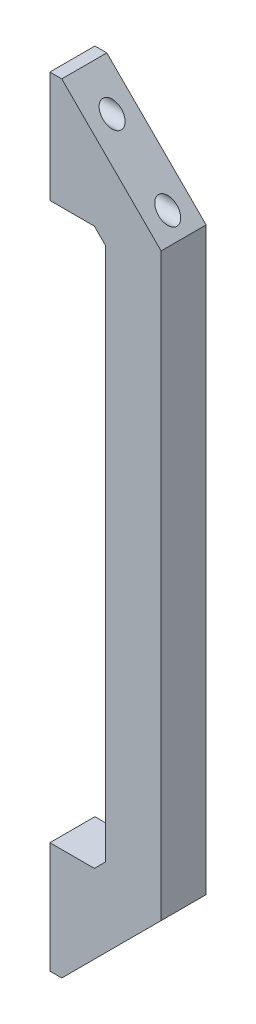
ISO-10303-21;
HEADER;
FILE_DESCRIPTION(('STEP AP214'),'2;1');
FILE_NAME('part.step','',(''),(''),'','','');
FILE_SCHEMA(('AUTOMOTIVE_DESIGN { 1 0 10303 214 1 1 1 1 }'));
ENDSEC;
DATA;
#1=APPLICATION_CONTEXT('core data for automotive mechanical design processes');
#2=APPLICATION_PROTOCOL_DEFINITION('international standard','automotive_design',2000,#1);
#3=PRODUCT_CONTEXT('',#1,'mechanical');
#4=PRODUCT('Part','Part','',(#3));
#5=PRODUCT_RELATED_PRODUCT_CATEGORY('part','',(#4));
#6=PRODUCT_DEFINITION_FORMATION('','',#4);
#7=PRODUCT_DEFINITION_CONTEXT('part definition',#1,'design');
#8=PRODUCT_DEFINITION('design','',#6,#7);
#9=PRODUCT_DEFINITION_SHAPE('','',#8);
#10=(LENGTH_UNIT() NAMED_UNIT(*) SI_UNIT(.MILLI.,.METRE.));
#11=(NAMED_UNIT(*) PLANE_ANGLE_UNIT() SI_UNIT($,.RADIAN.));
#12=(NAMED_UNIT(*) SI_UNIT($,.STERADIAN.) SOLID_ANGLE_UNIT());
#13=UNCERTAINTY_MEASURE_WITH_UNIT(LENGTH_MEASURE(1.E-05),#10,'distance_accuracy_value','');
#14=(GEOMETRIC_REPRESENTATION_CONTEXT(3) GLOBAL_UNCERTAINTY_ASSIGNED_CONTEXT((#13)) GLOBAL_UNIT_ASSIGNED_CONTEXT((#10,
#11,#12)) REPRESENTATION_CONTEXT('',''));
#15=CARTESIAN_POINT('',(0.,0.,0.));
#16=DIRECTION('',(0.,0.,1.));
#17=DIRECTION('',(1.,0.,0.));
#18=AXIS2_PLACEMENT_3D('',#15,#16,#17);
#19=CARTESIAN_POINT('',(0.,0.,8.1));
#20=DIRECTION('',(0.,1.,0.));
#21=DIRECTION('',(-1.,0.,0.));
#22=AXIS2_PLACEMENT_3D('',#19,#20,#21);
#23=PLANE('',#22);
#24=DIRECTION('',(1.,0.,0.));
#25=VECTOR('',#24,1.);
#26=CARTESIAN_POINT('',(0.,0.,0.));
#27=LINE('',#26,#25);
#28=CARTESIAN_POINT('',(0.,0.,0.));
#29=VERTEX_POINT('',#28);
#30=CARTESIAN_POINT('',(2.14213562373119,0.,0.));
#31=VERTEX_POINT('',#30);
#32=EDGE_CURVE('E153',#29,#31,#27,.T.);
#33=ORIENTED_EDGE('',*,*,#32,.T.);
#34=DIRECTION('',(0.,0.,-1.));
#35=VECTOR('',#34,1.);
#36=CARTESIAN_POINT('',(2.14213562373119,0.,8.1));
#37=LINE('',#36,#35);
#38=CARTESIAN_POINT('',(2.14213562373119,0.,8.1));
#39=VERTEX_POINT('',#38);
#40=EDGE_CURVE('E11',#39,#31,#37,.T.);
#41=ORIENTED_EDGE('',*,*,#40,.F.);
#42=DIRECTION('',(1.,0.,0.));
#43=VECTOR('',#42,1.);
#44=CARTESIAN_POINT('',(0.,0.,8.1));
#45=LINE('',#44,#43);
#46=CARTESIAN_POINT('',(0.,0.,8.1));
#47=VERTEX_POINT('',#46);
#48=EDGE_CURVE('E176',#47,#39,#45,.T.);
#49=ORIENTED_EDGE('',*,*,#48,.F.);
#50=DIRECTION('',(0.,0.,-1.));
#51=VECTOR('',#50,1.);
#52=CARTESIAN_POINT('',(0.,0.,8.1));
#53=LINE('',#52,#51);
#54=EDGE_CURVE('E149',#47,#29,#53,.T.);
#55=ORIENTED_EDGE('',*,*,#54,.T.);
#56=EDGE_LOOP('',(#33,#41,#49,#55));
#57=FACE_BOUND('',#56,.T.);
#58=ADVANCED_FACE('F33',(#57),#23,.F.);
#59=CARTESIAN_POINT('',(2.14213562373119,0.,8.1));
#60=DIRECTION('',(-0.707106781186554,0.707106781186541,0.));
#61=DIRECTION('',(-0.707106781186541,-0.707106781186554,0.));
#62=AXIS2_PLACEMENT_3D('',#59,#60,#61);
#63=PLANE('',#62);
#64=CARTESIAN_POINT('',(7.1421356237311,5.,4.05));
#65=DIRECTION('',(-0.707106781186554,0.707106781186541,0.));
#66=DIRECTION('',(-0.707106781186541,-0.707106781186554,0.));
#67=AXIS2_PLACEMENT_3D('',#64,#65,#66);
#68=ELLIPSE('',#67,2.33345237791559,1.65);
#69=CARTESIAN_POINT('',(5.49213562373113,3.35,4.05));
#70=VERTEX_POINT('',#69);
#71=EDGE_CURVE('E389',#70,#70,#68,.T.);
#72=ORIENTED_EDGE('',*,*,#71,.T.);
#73=EDGE_LOOP('',(#72));
#74=FACE_BOUND('',#73,.T.);
#75=CARTESIAN_POINT('',(17.1421356237309,15.,4.05));
#76=DIRECTION('',(-0.707106781186554,0.707106781186541,0.));
#77=DIRECTION('',(-0.707106781186541,-0.707106781186554,0.));
#78=AXIS2_PLACEMENT_3D('',#75,#76,#77);
#79=ELLIPSE('',#78,2.33345237791559,1.65);
#80=CARTESIAN_POINT('',(15.4921356237309,13.35,4.05));
#81=VERTEX_POINT('',#80);
#82=EDGE_CURVE('E157',#81,#81,#79,.T.);
#83=ORIENTED_EDGE('',*,*,#82,.T.);
#84=EDGE_LOOP('',(#83));
#85=FACE_BOUND('',#84,.T.);
#86=DIRECTION('',(0.707106781186541,0.707106781186554,0.));
#87=VECTOR('',#86,1.);
#88=CARTESIAN_POINT('',(2.14213562373119,0.,0.));
#89=LINE('',#88,#87);
#90=CARTESIAN_POINT('',(20.,17.8578643762691,0.));
#91=VERTEX_POINT('',#90);
#92=EDGE_CURVE('E156',#31,#91,#89,.T.);
#93=ORIENTED_EDGE('',*,*,#92,.T.);
#94=DIRECTION('',(0.,0.,-1.));
#95=VECTOR('',#94,1.);
#96=CARTESIAN_POINT('',(20.,17.8578643762691,8.1));
#97=LINE('',#96,#95);
#98=CARTESIAN_POINT('',(20.,17.8578643762691,8.1));
#99=VERTEX_POINT('',#98);
#100=EDGE_CURVE('E41',#99,#91,#97,.T.);
#101=ORIENTED_EDGE('',*,*,#100,.F.);
#102=DIRECTION('',(0.707106781186541,0.707106781186554,0.));
#103=VECTOR('',#102,1.);
#104=CARTESIAN_POINT('',(2.14213562373119,0.,8.1));
#105=LINE('',#104,#103);
#106=EDGE_CURVE('E104',#39,#99,#105,.T.);
#107=ORIENTED_EDGE('',*,*,#106,.F.);
#108=ORIENTED_EDGE('',*,*,#40,.T.);
#109=EDGE_LOOP('',(#93,#101,#107,#108));
#110=FACE_BOUND('',#109,.T.);
#111=ADVANCED_FACE('F257',(#74,#85,#110),#63,.F.);
#112=CARTESIAN_POINT('',(20.,17.8578643762691,8.1));
#113=DIRECTION('',(-1.,0.,0.));
#114=DIRECTION('',(0.,-1.,0.));
#115=AXIS2_PLACEMENT_3D('',#112,#113,#114);
#116=PLANE('',#115);
#117=DIRECTION('',(0.,1.,0.));
#118=VECTOR('',#117,1.);
#119=CARTESIAN_POINT('',(20.,17.8578643762691,0.));
#120=LINE('',#119,#118);
#121=CARTESIAN_POINT('',(20.,122.142135623731,0.));
#122=VERTEX_POINT('',#121);
#123=EDGE_CURVE('E159',#91,#122,#120,.T.);
#124=ORIENTED_EDGE('',*,*,#123,.T.);
#125=DIRECTION('',(0.,0.,-1.));
#126=VECTOR('',#125,1.);
#127=CARTESIAN_POINT('',(20.,122.142135623731,8.1));
#128=LINE('',#127,#126);
#129=CARTESIAN_POINT('',(20.,122.142135623731,8.1));
#130=VERTEX_POINT('',#129);
#131=EDGE_CURVE('E195',#130,#122,#128,.T.);
#132=ORIENTED_EDGE('',*,*,#131,.F.);
#133=DIRECTION('',(0.,1.,0.));
#134=VECTOR('',#133,1.);
#135=CARTESIAN_POINT('',(20.,17.8578643762691,8.1));
#136=LINE('',#135,#134);
#137=EDGE_CURVE('E203',#99,#130,#136,.T.);
#138=ORIENTED_EDGE('',*,*,#137,.F.);
#139=ORIENTED_EDGE('',*,*,#100,.T.);
#140=EDGE_LOOP('',(#124,#132,#138,#139));
#141=FACE_BOUND('',#140,.T.);
#142=ADVANCED_FACE('F201',(#141),#116,.F.);
#143=CARTESIAN_POINT('',(2.14213562373117,140.,8.1));
#144=DIRECTION('',(-0.707106781186554,-0.707106781186541,0.));
#145=DIRECTION('',(0.707106781186541,-0.707106781186554,0.));
#146=AXIS2_PLACEMENT_3D('',#143,#144,#145);
#147=PLANE('',#146);
#148=CARTESIAN_POINT('',(7.14213562373108,135.,4.05));
#149=DIRECTION('',(-0.707106781186554,-0.707106781186541,0.));
#150=DIRECTION('',(-0.707106781186541,0.707106781186554,0.));
#151=AXIS2_PLACEMENT_3D('',#148,#149,#150);
#152=ELLIPSE('',#151,2.3334523779156,1.65000000000001);
#153=CARTESIAN_POINT('',(5.49213562373111,136.65,4.05));
#154=VERTEX_POINT('',#153);
#155=EDGE_CURVE('E382',#154,#154,#152,.T.);
#156=ORIENTED_EDGE('',*,*,#155,.T.);
#157=EDGE_LOOP('',(#156));
#158=FACE_BOUND('',#157,.T.);
#159=CARTESIAN_POINT('',(17.1421356237309,125.,4.05));
#160=DIRECTION('',(-0.707106781186554,-0.707106781186541,0.));
#161=DIRECTION('',(-0.707106781186541,0.707106781186554,0.));
#162=AXIS2_PLACEMENT_3D('',#159,#160,#161);
#163=ELLIPSE('',#162,2.33345237791559,1.65);
#164=CARTESIAN_POINT('',(15.4921356237309,126.65,4.05));
#165=VERTEX_POINT('',#164);
#166=EDGE_CURVE('E384',#165,#165,#163,.T.);
#167=ORIENTED_EDGE('',*,*,#166,.T.);
#168=EDGE_LOOP('',(#167));
#169=FACE_BOUND('',#168,.T.);
#170=DIRECTION('',(-0.707106781186541,0.707106781186554,0.));
#171=VECTOR('',#170,1.);
#172=CARTESIAN_POINT('',(2.14213562373117,140.,0.));
#173=LINE('',#172,#171);
#174=CARTESIAN_POINT('',(2.14213562373117,140.,0.));
#175=VERTEX_POINT('',#174);
#176=EDGE_CURVE('E161',#122,#175,#173,.T.);
#177=ORIENTED_EDGE('',*,*,#176,.T.);
#178=DIRECTION('',(0.,0.,-1.));
#179=VECTOR('',#178,1.);
#180=CARTESIAN_POINT('',(2.14213562373117,140.,8.1));
#181=LINE('',#180,#179);
#182=CARTESIAN_POINT('',(2.14213562373117,140.,8.1));
#183=VERTEX_POINT('',#182);
#184=EDGE_CURVE('E192',#183,#175,#181,.T.);
#185=ORIENTED_EDGE('',*,*,#184,.F.);
#186=DIRECTION('',(-0.707106781186541,0.707106781186554,0.));
#187=VECTOR('',#186,1.);
#188=CARTESIAN_POINT('',(2.14213562373117,140.,8.1));
#189=LINE('',#188,#187);
#190=EDGE_CURVE('E221',#130,#183,#189,.T.);
#191=ORIENTED_EDGE('',*,*,#190,.F.);
#192=ORIENTED_EDGE('',*,*,#131,.T.);
#193=EDGE_LOOP('',(#177,#185,#191,#192));
#194=FACE_BOUND('',#193,.T.);
#195=ADVANCED_FACE('F212',(#158,#169,#194),#147,.F.);
#196=CARTESIAN_POINT('',(0.,140.,8.1));
#197=DIRECTION('',(0.,-1.,0.));
#198=DIRECTION('',(0.,0.,-1.));
#199=AXIS2_PLACEMENT_3D('',#196,#197,#198);
#200=PLANE('',#199);
#201=DIRECTION('',(-1.,0.,0.));
#202=VECTOR('',#201,1.);
#203=CARTESIAN_POINT('',(0.,140.,0.));
#204=LINE('',#203,#202);
#205=CARTESIAN_POINT('',(0.,140.,0.));
#206=VERTEX_POINT('',#205);
#207=EDGE_CURVE('E163',#175,#206,#204,.T.);
#208=ORIENTED_EDGE('',*,*,#207,.T.);
#209=DIRECTION('',(0.,0.,-1.));
#210=VECTOR('',#209,1.);
#211=CARTESIAN_POINT('',(0.,140.,8.1));
#212=LINE('',#211,#210);
#213=CARTESIAN_POINT('',(0.,140.,8.1));
#214=VERTEX_POINT('',#213);
#215=EDGE_CURVE('E189',#214,#206,#212,.T.);
#216=ORIENTED_EDGE('',*,*,#215,.F.);
#217=DIRECTION('',(-1.,0.,0.));
#218=VECTOR('',#217,1.);
#219=CARTESIAN_POINT('',(0.,140.,8.1));
#220=LINE('',#219,#218);
#221=EDGE_CURVE('E218',#183,#214,#220,.T.);
#222=ORIENTED_EDGE('',*,*,#221,.F.);
#223=ORIENTED_EDGE('',*,*,#184,.T.);
#224=EDGE_LOOP('',(#208,#216,#222,#223));
#225=FACE_BOUND('',#224,.T.);
#226=ADVANCED_FACE('F216',(#225),#200,.F.);
#227=CARTESIAN_POINT('',(0.,140.,8.1));
#228=DIRECTION('',(1.,0.,0.));
#229=DIRECTION('',(0.,1.,0.));
#230=AXIS2_PLACEMENT_3D('',#227,#228,#229);
#231=PLANE('',#230);
#232=CARTESIAN_POINT('',(0.,135.,4.05));
#233=DIRECTION('',(-1.,0.,0.));
#234=DIRECTION('',(0.,0.,1.));
#235=AXIS2_PLACEMENT_3D('',#232,#233,#234);
#236=CIRCLE('',#235,1.65000000000001);
#237=CARTESIAN_POINT('',(0.,135.,5.70000000000001));
#238=VERTEX_POINT('',#237);
#239=EDGE_CURVE('E379',#238,#238,#236,.T.);
#240=ORIENTED_EDGE('',*,*,#239,.F.);
#241=EDGE_LOOP('',(#240));
#242=FACE_BOUND('',#241,.T.);
#243=CARTESIAN_POINT('',(0.,125.,4.05));
#244=DIRECTION('',(-1.,0.,0.));
#245=DIRECTION('',(0.,0.,-1.));
#246=AXIS2_PLACEMENT_3D('',#243,#244,#245);
#247=CIRCLE('',#246,1.65);
#248=CARTESIAN_POINT('',(0.,125.,2.4));
#249=VERTEX_POINT('',#248);
#250=EDGE_CURVE('E400',#249,#249,#247,.T.);
#251=ORIENTED_EDGE('',*,*,#250,.F.);
#252=EDGE_LOOP('',(#251));
#253=FACE_BOUND('',#252,.T.);
#254=DIRECTION('',(0.,-1.,0.));
#255=VECTOR('',#254,1.);
#256=CARTESIAN_POINT('',(0.,140.,0.));
#257=LINE('',#256,#255);
#258=CARTESIAN_POINT('',(0.,120.,0.));
#259=VERTEX_POINT('',#258);
#260=EDGE_CURVE('E165',#206,#259,#257,.T.);
#261=ORIENTED_EDGE('',*,*,#260,.T.);
#262=DIRECTION('',(0.,0.,-1.));
#263=VECTOR('',#262,1.);
#264=CARTESIAN_POINT('',(0.,120.,8.1));
#265=LINE('',#264,#263);
#266=CARTESIAN_POINT('',(0.,120.,8.1));
#267=VERTEX_POINT('',#266);
#268=EDGE_CURVE('E186',#267,#259,#265,.T.);
#269=ORIENTED_EDGE('',*,*,#268,.F.);
#270=DIRECTION('',(0.,-1.,0.));
#271=VECTOR('',#270,1.);
#272=CARTESIAN_POINT('',(0.,140.,8.1));
#273=LINE('',#272,#271);
#274=EDGE_CURVE('E220',#214,#267,#273,.T.);
#275=ORIENTED_EDGE('',*,*,#274,.F.);
#276=ORIENTED_EDGE('',*,*,#215,.T.);
#277=EDGE_LOOP('',(#261,#269,#275,#276));
#278=FACE_BOUND('',#277,.T.);
#279=ADVANCED_FACE('F274',(#242,#253,#278),#231,.F.);
#280=CARTESIAN_POINT('',(0.,120.,8.1));
#281=DIRECTION('',(0.,1.,0.));
#282=DIRECTION('',(-1.,0.,0.));
#283=AXIS2_PLACEMENT_3D('',#280,#281,#282);
#284=PLANE('',#283);
#285=DIRECTION('',(1.,0.,0.));
#286=VECTOR('',#285,1.);
#287=CARTESIAN_POINT('',(0.,120.,0.));
#288=LINE('',#287,#286);
#289=CARTESIAN_POINT('',(7.99999999999999,120.,0.));
#290=VERTEX_POINT('',#289);
#291=EDGE_CURVE('E167',#259,#290,#288,.T.);
#292=ORIENTED_EDGE('',*,*,#291,.T.);
#293=DIRECTION('',(0.,0.,-1.));
#294=VECTOR('',#293,1.);
#295=CARTESIAN_POINT('',(7.99999999999999,120.,8.1));
#296=LINE('',#295,#294);
#297=CARTESIAN_POINT('',(7.99999999999999,120.,8.1));
#298=VERTEX_POINT('',#297);
#299=EDGE_CURVE('E183',#298,#290,#296,.T.);
#300=ORIENTED_EDGE('',*,*,#299,.F.);
#301=DIRECTION('',(1.,0.,0.));
#302=VECTOR('',#301,1.);
#303=CARTESIAN_POINT('',(0.,120.,8.1));
#304=LINE('',#303,#302);
#305=EDGE_CURVE('E223',#267,#298,#304,.T.);
#306=ORIENTED_EDGE('',*,*,#305,.F.);
#307=ORIENTED_EDGE('',*,*,#268,.T.);
#308=EDGE_LOOP('',(#292,#300,#306,#307));
#309=FACE_BOUND('',#308,.T.);
#310=ADVANCED_FACE('F277',(#309),#284,.F.);
#311=CARTESIAN_POINT('',(7.99999999999999,120.,8.1));
#312=DIRECTION('',(0.707106781186553,0.707106781186542,0.));
#313=DIRECTION('',(-0.707106781186542,0.707106781186553,0.));
#314=AXIS2_PLACEMENT_3D('',#311,#312,#313);
#315=PLANE('',#314);
#316=DIRECTION('',(0.707106781186542,-0.707106781186553,0.));
#317=VECTOR('',#316,1.);
#318=CARTESIAN_POINT('',(7.99999999999999,120.,0.));
#319=LINE('',#318,#317);
#320=CARTESIAN_POINT('',(9.99999999999999,118.,0.));
#321=VERTEX_POINT('',#320);
#322=EDGE_CURVE('E169',#290,#321,#319,.T.);
#323=ORIENTED_EDGE('',*,*,#322,.T.);
#324=DIRECTION('',(0.,0.,-1.));
#325=VECTOR('',#324,1.);
#326=CARTESIAN_POINT('',(9.99999999999999,118.,8.1));
#327=LINE('',#326,#325);
#328=CARTESIAN_POINT('',(9.99999999999999,118.,8.1));
#329=VERTEX_POINT('',#328);
#330=EDGE_CURVE('E180',#329,#321,#327,.T.);
#331=ORIENTED_EDGE('',*,*,#330,.F.);
#332=DIRECTION('',(0.707106781186542,-0.707106781186553,0.));
#333=VECTOR('',#332,1.);
#334=CARTESIAN_POINT('',(7.99999999999999,120.,8.1));
#335=LINE('',#334,#333);
#336=EDGE_CURVE('E229',#298,#329,#335,.T.);
#337=ORIENTED_EDGE('',*,*,#336,.F.);
#338=ORIENTED_EDGE('',*,*,#299,.T.);
#339=EDGE_LOOP('',(#323,#331,#337,#338));
#340=FACE_BOUND('',#339,.T.);
#341=ADVANCED_FACE('F235',(#340),#315,.F.);
#342=CARTESIAN_POINT('',(10.,22.,8.1));
#343=DIRECTION('',(1.,0.,0.));
#344=DIRECTION('',(0.,1.,0.));
#345=AXIS2_PLACEMENT_3D('',#342,#343,#344);
#346=PLANE('',#345);
#347=DIRECTION('',(0.,-1.,0.));
#348=VECTOR('',#347,1.);
#349=CARTESIAN_POINT('',(10.,22.,0.));
#350=LINE('',#349,#348);
#351=CARTESIAN_POINT('',(10.,22.,0.));
#352=VERTEX_POINT('',#351);
#353=EDGE_CURVE('E171',#321,#352,#350,.T.);
#354=ORIENTED_EDGE('',*,*,#353,.T.);
#355=DIRECTION('',(0.,0.,-1.));
#356=VECTOR('',#355,1.);
#357=CARTESIAN_POINT('',(10.,22.,8.1));
#358=LINE('',#357,#356);
#359=CARTESIAN_POINT('',(10.,22.,8.1));
#360=VERTEX_POINT('',#359);
#361=EDGE_CURVE('E144',#360,#352,#358,.T.);
#362=ORIENTED_EDGE('',*,*,#361,.F.);
#363=DIRECTION('',(0.,-1.,0.));
#364=VECTOR('',#363,1.);
#365=CARTESIAN_POINT('',(10.,22.,8.1));
#366=LINE('',#365,#364);
#367=EDGE_CURVE('E135',#329,#360,#366,.T.);
#368=ORIENTED_EDGE('',*,*,#367,.F.);
#369=ORIENTED_EDGE('',*,*,#330,.T.);
#370=EDGE_LOOP('',(#354,#362,#368,#369));
#371=FACE_BOUND('',#370,.T.);
#372=ADVANCED_FACE('F239',(#371),#346,.F.);
#373=CARTESIAN_POINT('',(8.,20.,8.1));
#374=DIRECTION('',(0.707106781186554,-0.707106781186541,0.));
#375=DIRECTION('',(0.707106781186541,0.707106781186554,0.));
#376=AXIS2_PLACEMENT_3D('',#373,#374,#375);
#377=PLANE('',#376);
#378=DIRECTION('',(-0.707106781186541,-0.707106781186554,0.));
#379=VECTOR('',#378,1.);
#380=CARTESIAN_POINT('',(8.,20.,0.));
#381=LINE('',#380,#379);
#382=CARTESIAN_POINT('',(8.,20.,0.));
#383=VERTEX_POINT('',#382);
#384=EDGE_CURVE('E143',#352,#383,#381,.T.);
#385=ORIENTED_EDGE('',*,*,#384,.T.);
#386=DIRECTION('',(0.,0.,-1.));
#387=VECTOR('',#386,1.);
#388=CARTESIAN_POINT('',(8.,20.,8.1));
#389=LINE('',#388,#387);
#390=CARTESIAN_POINT('',(8.,20.,8.1));
#391=VERTEX_POINT('',#390);
#392=EDGE_CURVE('E140',#391,#383,#389,.T.);
#393=ORIENTED_EDGE('',*,*,#392,.F.);
#394=DIRECTION('',(-0.707106781186541,-0.707106781186554,0.));
#395=VECTOR('',#394,1.);
#396=CARTESIAN_POINT('',(8.,20.,8.1));
#397=LINE('',#396,#395);
#398=EDGE_CURVE('E129',#360,#391,#397,.T.);
#399=ORIENTED_EDGE('',*,*,#398,.F.);
#400=ORIENTED_EDGE('',*,*,#361,.T.);
#401=EDGE_LOOP('',(#385,#393,#399,#400));
#402=FACE_BOUND('',#401,.T.);
#403=ADVANCED_FACE('F141',(#402),#377,.F.);
#404=CARTESIAN_POINT('',(0.,20.,8.1));
#405=DIRECTION('',(0.,-1.,0.));
#406=DIRECTION('',(0.,0.,-1.));
#407=AXIS2_PLACEMENT_3D('',#404,#405,#406);
#408=PLANE('',#407);
#409=DIRECTION('',(-1.,0.,0.));
#410=VECTOR('',#409,1.);
#411=CARTESIAN_POINT('',(0.,20.,0.));
#412=LINE('',#411,#410);
#413=CARTESIAN_POINT('',(0.,20.,0.));
#414=VERTEX_POINT('',#413);
#415=EDGE_CURVE('E90',#383,#414,#412,.T.);
#416=ORIENTED_EDGE('',*,*,#415,.T.);
#417=DIRECTION('',(0.,0.,-1.));
#418=VECTOR('',#417,1.);
#419=CARTESIAN_POINT('',(0.,20.,8.1));
#420=LINE('',#419,#418);
#421=CARTESIAN_POINT('',(0.,20.,8.1));
#422=VERTEX_POINT('',#421);
#423=EDGE_CURVE('E145',#422,#414,#420,.T.);
#424=ORIENTED_EDGE('',*,*,#423,.F.);
#425=DIRECTION('',(-1.,0.,0.));
#426=VECTOR('',#425,1.);
#427=CARTESIAN_POINT('',(0.,20.,8.1));
#428=LINE('',#427,#426);
#429=EDGE_CURVE('E133',#391,#422,#428,.T.);
#430=ORIENTED_EDGE('',*,*,#429,.F.);
#431=ORIENTED_EDGE('',*,*,#392,.T.);
#432=EDGE_LOOP('',(#416,#424,#430,#431));
#433=FACE_BOUND('',#432,.T.);
#434=ADVANCED_FACE('F147',(#433),#408,.F.);
#435=CARTESIAN_POINT('',(0.,0.,8.1));
#436=DIRECTION('',(1.,0.,0.));
#437=DIRECTION('',(0.,0.,-1.));
#438=AXIS2_PLACEMENT_3D('',#435,#436,#437);
#439=PLANE('',#438);
#440=CARTESIAN_POINT('',(0.,5.,4.05));
#441=DIRECTION('',(-1.,0.,0.));
#442=DIRECTION('',(0.,0.,-1.));
#443=AXIS2_PLACEMENT_3D('',#440,#441,#442);
#444=CIRCLE('',#443,1.65);
#445=CARTESIAN_POINT('',(0.,5.,2.4));
#446=VERTEX_POINT('',#445);
#447=EDGE_CURVE('E399',#446,#446,#444,.T.);
#448=ORIENTED_EDGE('',*,*,#447,.F.);
#449=EDGE_LOOP('',(#448));
#450=FACE_BOUND('',#449,.T.);
#451=CARTESIAN_POINT('',(0.,15.,4.05));
#452=DIRECTION('',(-1.,0.,0.));
#453=DIRECTION('',(0.,0.,1.));
#454=AXIS2_PLACEMENT_3D('',#451,#452,#453);
#455=CIRCLE('',#454,1.65);
#456=CARTESIAN_POINT('',(0.,15.,5.7));
#457=VERTEX_POINT('',#456);
#458=EDGE_CURVE('E383',#457,#457,#455,.T.);
#459=ORIENTED_EDGE('',*,*,#458,.F.);
#460=EDGE_LOOP('',(#459));
#461=FACE_BOUND('',#460,.T.);
#462=DIRECTION('',(0.,-1.,0.));
#463=VECTOR('',#462,1.);
#464=CARTESIAN_POINT('',(0.,0.,0.));
#465=LINE('',#464,#463);
#466=EDGE_CURVE('E96',#414,#29,#465,.T.);
#467=ORIENTED_EDGE('',*,*,#466,.T.);
#468=ORIENTED_EDGE('',*,*,#54,.F.);
#469=DIRECTION('',(0.,-1.,0.));
#470=VECTOR('',#469,1.);
#471=CARTESIAN_POINT('',(0.,0.,8.1));
#472=LINE('',#471,#470);
#473=EDGE_CURVE('E49',#422,#47,#472,.T.);
#474=ORIENTED_EDGE('',*,*,#473,.F.);
#475=ORIENTED_EDGE('',*,*,#423,.T.);
#476=EDGE_LOOP('',(#467,#468,#474,#475));
#477=FACE_BOUND('',#476,.T.);
#478=ADVANCED_FACE('F243',(#450,#461,#477),#439,.F.);
#479=CARTESIAN_POINT('',(0.,0.,8.1));
#480=DIRECTION('',(0.,0.,1.));
#481=DIRECTION('',(1.,0.,0.));
#482=AXIS2_PLACEMENT_3D('',#479,#480,#481);
#483=PLANE('',#482);
#484=ORIENTED_EDGE('',*,*,#48,.T.);
#485=ORIENTED_EDGE('',*,*,#106,.T.);
#486=ORIENTED_EDGE('',*,*,#137,.T.);
#487=ORIENTED_EDGE('',*,*,#190,.T.);
#488=ORIENTED_EDGE('',*,*,#221,.T.);
#489=ORIENTED_EDGE('',*,*,#274,.T.);
#490=ORIENTED_EDGE('',*,*,#305,.T.);
#491=ORIENTED_EDGE('',*,*,#336,.T.);
#492=ORIENTED_EDGE('',*,*,#367,.T.);
#493=ORIENTED_EDGE('',*,*,#398,.T.);
#494=ORIENTED_EDGE('',*,*,#429,.T.);
#495=ORIENTED_EDGE('',*,*,#473,.T.);
#496=EDGE_LOOP('',(#484,#485,#486,#487,#488,#489,#490,#491,#492,#493,#494,#495));
#497=FACE_BOUND('',#496,.T.);
#498=ADVANCED_FACE('F131',(#497),#483,.T.);
#499=CARTESIAN_POINT('',(0.,0.,0.));
#500=DIRECTION('',(0.,0.,1.));
#501=DIRECTION('',(1.,0.,0.));
#502=AXIS2_PLACEMENT_3D('',#499,#500,#501);
#503=PLANE('',#502);
#504=ORIENTED_EDGE('',*,*,#32,.F.);
#505=ORIENTED_EDGE('',*,*,#466,.F.);
#506=ORIENTED_EDGE('',*,*,#415,.F.);
#507=ORIENTED_EDGE('',*,*,#384,.F.);
#508=ORIENTED_EDGE('',*,*,#353,.F.);
#509=ORIENTED_EDGE('',*,*,#322,.F.);
#510=ORIENTED_EDGE('',*,*,#291,.F.);
#511=ORIENTED_EDGE('',*,*,#260,.F.);
#512=ORIENTED_EDGE('',*,*,#207,.F.);
#513=ORIENTED_EDGE('',*,*,#176,.F.);
#514=ORIENTED_EDGE('',*,*,#123,.F.);
#515=ORIENTED_EDGE('',*,*,#92,.F.);
#516=EDGE_LOOP('',(#504,#505,#506,#507,#508,#509,#510,#511,#512,#513,#514,#515));
#517=FACE_BOUND('',#516,.T.);
#518=ADVANCED_FACE('F207',(#517),#503,.F.);
#519=CARTESIAN_POINT('',(20.,15.,4.05));
#520=DIRECTION('',(-1.,0.,0.));
#521=DIRECTION('',(0.,0.,1.));
#522=AXIS2_PLACEMENT_3D('',#519,#520,#521);
#523=CYLINDRICAL_SURFACE('',#522,1.65);
#524=ORIENTED_EDGE('',*,*,#458,.T.);
#525=EDGE_LOOP('',(#524));
#526=FACE_BOUND('',#525,.T.);
#527=ORIENTED_EDGE('',*,*,#82,.F.);
#528=EDGE_LOOP('',(#527));
#529=FACE_BOUND('',#528,.T.);
#530=ADVANCED_FACE('F310',(#526,#529),#523,.F.);
#531=CARTESIAN_POINT('',(20.,5.,4.05));
#532=DIRECTION('',(-1.,0.,0.));
#533=DIRECTION('',(0.,0.,1.));
#534=AXIS2_PLACEMENT_3D('',#531,#532,#533);
#535=CYLINDRICAL_SURFACE('',#534,1.65);
#536=ORIENTED_EDGE('',*,*,#447,.T.);
#537=EDGE_LOOP('',(#536));
#538=FACE_BOUND('',#537,.T.);
#539=ORIENTED_EDGE('',*,*,#71,.F.);
#540=EDGE_LOOP('',(#539));
#541=FACE_BOUND('',#540,.T.);
#542=ADVANCED_FACE('F342',(#538,#541),#535,.F.);
#543=CARTESIAN_POINT('',(20.,125.,4.05));
#544=DIRECTION('',(-1.,0.,0.));
#545=DIRECTION('',(0.,0.,1.));
#546=AXIS2_PLACEMENT_3D('',#543,#544,#545);
#547=CYLINDRICAL_SURFACE('',#546,1.65);
#548=ORIENTED_EDGE('',*,*,#250,.T.);
#549=EDGE_LOOP('',(#548));
#550=FACE_BOUND('',#549,.T.);
#551=ORIENTED_EDGE('',*,*,#166,.F.);
#552=EDGE_LOOP('',(#551));
#553=FACE_BOUND('',#552,.T.);
#554=ADVANCED_FACE('F352',(#550,#553),#547,.F.);
#555=CARTESIAN_POINT('',(20.,135.,4.05));
#556=DIRECTION('',(-1.,0.,0.));
#557=DIRECTION('',(0.,0.,1.));
#558=AXIS2_PLACEMENT_3D('',#555,#556,#557);
#559=CYLINDRICAL_SURFACE('',#558,1.65000000000001);
#560=ORIENTED_EDGE('',*,*,#239,.T.);
#561=EDGE_LOOP('',(#560));
#562=FACE_BOUND('',#561,.T.);
#563=ORIENTED_EDGE('',*,*,#155,.F.);
#564=EDGE_LOOP('',(#563));
#565=FACE_BOUND('',#564,.T.);
#566=ADVANCED_FACE('F362',(#562,#565),#559,.F.);
#567=CLOSED_SHELL('',(#58,#111,#142,#195,#226,#279,#310,#341,#372,#403,#434,#478,#498,#518,#530,
#542,#554,#566));
#568=MANIFOLD_SOLID_BREP('B2',#567);
#569=ADVANCED_BREP_SHAPE_REPRESENTATION('',(#18,#568),#14);
#570=SHAPE_DEFINITION_REPRESENTATION(#9,#569);
ENDSEC;
END-ISO-10303-21;
